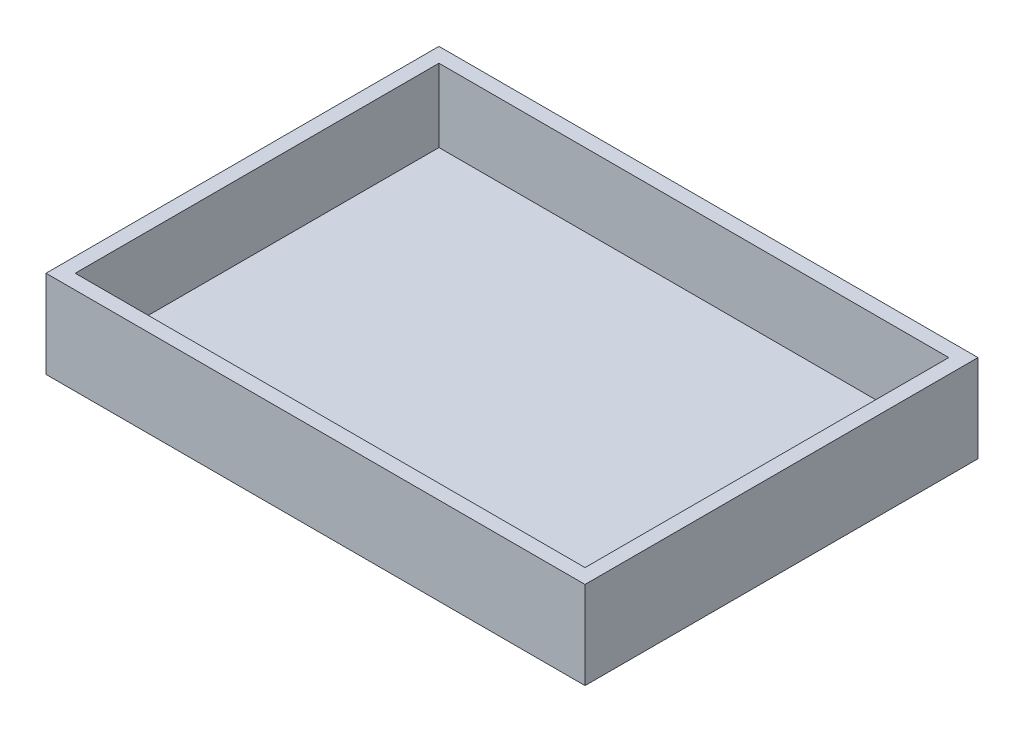
ISO-10303-21;
HEADER;
FILE_DESCRIPTION(('STEP AP214'),'2;1');
FILE_NAME('part.step','',(''),(''),'','','');
FILE_SCHEMA(('AUTOMOTIVE_DESIGN { 1 0 10303 214 1 1 1 1 }'));
ENDSEC;
DATA;
#1=APPLICATION_CONTEXT('core data for automotive mechanical design processes');
#2=APPLICATION_PROTOCOL_DEFINITION('international standard','automotive_design',2000,#1);
#3=PRODUCT_CONTEXT('',#1,'mechanical');
#4=PRODUCT('Part','Part','',(#3));
#5=PRODUCT_RELATED_PRODUCT_CATEGORY('part','',(#4));
#6=PRODUCT_DEFINITION_FORMATION('','',#4);
#7=PRODUCT_DEFINITION_CONTEXT('part definition',#1,'design');
#8=PRODUCT_DEFINITION('design','',#6,#7);
#9=PRODUCT_DEFINITION_SHAPE('','',#8);
#10=(LENGTH_UNIT() NAMED_UNIT(*) SI_UNIT(.MILLI.,.METRE.));
#11=(NAMED_UNIT(*) PLANE_ANGLE_UNIT() SI_UNIT($,.RADIAN.));
#12=(NAMED_UNIT(*) SI_UNIT($,.STERADIAN.) SOLID_ANGLE_UNIT());
#13=UNCERTAINTY_MEASURE_WITH_UNIT(LENGTH_MEASURE(1.E-05),#10,'distance_accuracy_value','');
#14=(GEOMETRIC_REPRESENTATION_CONTEXT(3) GLOBAL_UNCERTAINTY_ASSIGNED_CONTEXT((#13)) GLOBAL_UNIT_ASSIGNED_CONTEXT((#10,
#11,#12)) REPRESENTATION_CONTEXT('',''));
#15=CARTESIAN_POINT('',(0.,0.,0.));
#16=DIRECTION('',(0.,0.,1.));
#17=DIRECTION('',(1.,0.,0.));
#18=AXIS2_PLACEMENT_3D('',#15,#16,#17);
#19=CARTESIAN_POINT('',(0.,10.,0.));
#20=DIRECTION('',(0.,1.,0.));
#21=DIRECTION('',(0.,0.,1.));
#22=AXIS2_PLACEMENT_3D('',#19,#20,#21);
#23=PLANE('',#22);
#24=DIRECTION('',(1.,0.,0.));
#25=VECTOR('',#24,1.);
#26=CARTESIAN_POINT('',(-36.9,10.,26.9));
#27=LINE('',#26,#25);
#28=CARTESIAN_POINT('',(-36.9,10.,26.9));
#29=VERTEX_POINT('',#28);
#30=CARTESIAN_POINT('',(36.9,10.,26.9));
#31=VERTEX_POINT('',#30);
#32=EDGE_CURVE('E184',#29,#31,#27,.T.);
#33=ORIENTED_EDGE('',*,*,#32,.T.);
#34=DIRECTION('',(0.,0.,-1.));
#35=VECTOR('',#34,1.);
#36=CARTESIAN_POINT('',(36.9,10.,26.9));
#37=LINE('',#36,#35);
#38=CARTESIAN_POINT('',(36.9,10.,-26.9));
#39=VERTEX_POINT('',#38);
#40=EDGE_CURVE('E187',#31,#39,#37,.T.);
#41=ORIENTED_EDGE('',*,*,#40,.T.);
#42=DIRECTION('',(-1.,0.,0.));
#43=VECTOR('',#42,1.);
#44=CARTESIAN_POINT('',(-36.9,10.,-26.9));
#45=LINE('',#44,#43);
#46=CARTESIAN_POINT('',(-36.9,10.,-26.9));
#47=VERTEX_POINT('',#46);
#48=EDGE_CURVE('E190',#39,#47,#45,.T.);
#49=ORIENTED_EDGE('',*,*,#48,.T.);
#50=DIRECTION('',(0.,0.,1.));
#51=VECTOR('',#50,1.);
#52=CARTESIAN_POINT('',(-36.9,10.,26.9));
#53=LINE('',#52,#51);
#54=EDGE_CURVE('E71',#47,#29,#53,.T.);
#55=ORIENTED_EDGE('',*,*,#54,.T.);
#56=EDGE_LOOP('',(#33,#41,#49,#55));
#57=FACE_BOUND('',#56,.T.);
#58=DIRECTION('',(-1.,0.,0.));
#59=VECTOR('',#58,1.);
#60=CARTESIAN_POINT('',(-34.9,10.,-24.9));
#61=LINE('',#60,#59);
#62=CARTESIAN_POINT('',(34.9,10.,-24.9));
#63=VERTEX_POINT('',#62);
#64=CARTESIAN_POINT('',(-34.9,10.,-24.9));
#65=VERTEX_POINT('',#64);
#66=EDGE_CURVE('E148',#63,#65,#61,.T.);
#67=ORIENTED_EDGE('',*,*,#66,.F.);
#68=DIRECTION('',(0.,0.,-1.));
#69=VECTOR('',#68,1.);
#70=CARTESIAN_POINT('',(34.9,10.,24.9));
#71=LINE('',#70,#69);
#72=CARTESIAN_POINT('',(34.9,10.,24.9));
#73=VERTEX_POINT('',#72);
#74=EDGE_CURVE('E145',#73,#63,#71,.T.);
#75=ORIENTED_EDGE('',*,*,#74,.F.);
#76=DIRECTION('',(1.,0.,0.));
#77=VECTOR('',#76,1.);
#78=CARTESIAN_POINT('',(-34.9,10.,24.9));
#79=LINE('',#78,#77);
#80=CARTESIAN_POINT('',(-34.9,10.,24.9));
#81=VERTEX_POINT('',#80);
#82=EDGE_CURVE('E155',#81,#73,#79,.T.);
#83=ORIENTED_EDGE('',*,*,#82,.F.);
#84=DIRECTION('',(0.,0.,1.));
#85=VECTOR('',#84,1.);
#86=CARTESIAN_POINT('',(-34.9,10.,24.9));
#87=LINE('',#86,#85);
#88=EDGE_CURVE('E152',#65,#81,#87,.T.);
#89=ORIENTED_EDGE('',*,*,#88,.F.);
#90=EDGE_LOOP('',(#67,#75,#83,#89));
#91=FACE_BOUND('',#90,.T.);
#92=ADVANCED_FACE('F47',(#57,#91),#23,.T.);
#93=CARTESIAN_POINT('',(-36.9,10.,26.9));
#94=DIRECTION('',(0.,0.,-1.));
#95=DIRECTION('',(-1.,0.,0.));
#96=AXIS2_PLACEMENT_3D('',#93,#94,#95);
#97=PLANE('',#96);
#98=DIRECTION('',(0.,-1.,0.));
#99=VECTOR('',#98,1.);
#100=CARTESIAN_POINT('',(-36.9,10.,26.9));
#101=LINE('',#100,#99);
#102=CARTESIAN_POINT('',(-36.9,-2.,26.9));
#103=VERTEX_POINT('',#102);
#104=EDGE_CURVE('E121',#29,#103,#101,.T.);
#105=ORIENTED_EDGE('',*,*,#104,.T.);
#106=DIRECTION('',(-1.,0.,0.));
#107=VECTOR('',#106,1.);
#108=CARTESIAN_POINT('',(-36.9,-2.,26.9));
#109=LINE('',#108,#107);
#110=CARTESIAN_POINT('',(36.9,-2.,26.9));
#111=VERTEX_POINT('',#110);
#112=EDGE_CURVE('E136',#111,#103,#109,.T.);
#113=ORIENTED_EDGE('',*,*,#112,.F.);
#114=DIRECTION('',(0.,-1.,0.));
#115=VECTOR('',#114,1.);
#116=CARTESIAN_POINT('',(36.9,10.,26.9));
#117=LINE('',#116,#115);
#118=EDGE_CURVE('E11',#31,#111,#117,.T.);
#119=ORIENTED_EDGE('',*,*,#118,.F.);
#120=ORIENTED_EDGE('',*,*,#32,.F.);
#121=EDGE_LOOP('',(#105,#113,#119,#120));
#122=FACE_BOUND('',#121,.T.);
#123=ADVANCED_FACE('F49',(#122),#97,.F.);
#124=CARTESIAN_POINT('',(36.9,10.,26.9));
#125=DIRECTION('',(-1.,0.,0.));
#126=DIRECTION('',(0.,0.,1.));
#127=AXIS2_PLACEMENT_3D('',#124,#125,#126);
#128=PLANE('',#127);
#129=ORIENTED_EDGE('',*,*,#118,.T.);
#130=DIRECTION('',(0.,0.,1.));
#131=VECTOR('',#130,1.);
#132=CARTESIAN_POINT('',(36.9,-2.,26.9));
#133=LINE('',#132,#131);
#134=CARTESIAN_POINT('',(36.9,-2.,-26.9));
#135=VERTEX_POINT('',#134);
#136=EDGE_CURVE('E131',#135,#111,#133,.T.);
#137=ORIENTED_EDGE('',*,*,#136,.F.);
#138=DIRECTION('',(0.,-1.,0.));
#139=VECTOR('',#138,1.);
#140=CARTESIAN_POINT('',(36.9,10.,-26.9));
#141=LINE('',#140,#139);
#142=EDGE_CURVE('E56',#39,#135,#141,.T.);
#143=ORIENTED_EDGE('',*,*,#142,.F.);
#144=ORIENTED_EDGE('',*,*,#40,.F.);
#145=EDGE_LOOP('',(#129,#137,#143,#144));
#146=FACE_BOUND('',#145,.T.);
#147=ADVANCED_FACE('F202',(#146),#128,.F.);
#148=CARTESIAN_POINT('',(-36.9,10.,-26.9));
#149=DIRECTION('',(0.,0.,1.));
#150=DIRECTION('',(1.,0.,0.));
#151=AXIS2_PLACEMENT_3D('',#148,#149,#150);
#152=PLANE('',#151);
#153=ORIENTED_EDGE('',*,*,#142,.T.);
#154=DIRECTION('',(1.,0.,0.));
#155=VECTOR('',#154,1.);
#156=CARTESIAN_POINT('',(-36.9,-2.,-26.9));
#157=LINE('',#156,#155);
#158=CARTESIAN_POINT('',(-36.9,-2.,-26.9));
#159=VERTEX_POINT('',#158);
#160=EDGE_CURVE('E124',#159,#135,#157,.T.);
#161=ORIENTED_EDGE('',*,*,#160,.F.);
#162=DIRECTION('',(0.,-1.,0.));
#163=VECTOR('',#162,1.);
#164=CARTESIAN_POINT('',(-36.9,10.,-26.9));
#165=LINE('',#164,#163);
#166=EDGE_CURVE('E113',#47,#159,#165,.T.);
#167=ORIENTED_EDGE('',*,*,#166,.F.);
#168=ORIENTED_EDGE('',*,*,#48,.F.);
#169=EDGE_LOOP('',(#153,#161,#167,#168));
#170=FACE_BOUND('',#169,.T.);
#171=ADVANCED_FACE('F125',(#170),#152,.F.);
#172=CARTESIAN_POINT('',(-36.9,10.,26.9));
#173=DIRECTION('',(1.,0.,0.));
#174=DIRECTION('',(0.,0.,-1.));
#175=AXIS2_PLACEMENT_3D('',#172,#173,#174);
#176=PLANE('',#175);
#177=ORIENTED_EDGE('',*,*,#166,.T.);
#178=DIRECTION('',(0.,0.,-1.));
#179=VECTOR('',#178,1.);
#180=CARTESIAN_POINT('',(-36.9,-2.,26.9));
#181=LINE('',#180,#179);
#182=EDGE_CURVE('E117',#103,#159,#181,.T.);
#183=ORIENTED_EDGE('',*,*,#182,.F.);
#184=ORIENTED_EDGE('',*,*,#104,.F.);
#185=ORIENTED_EDGE('',*,*,#54,.F.);
#186=EDGE_LOOP('',(#177,#183,#184,#185));
#187=FACE_BOUND('',#186,.T.);
#188=ADVANCED_FACE('F115',(#187),#176,.F.);
#189=CARTESIAN_POINT('',(34.9,10.,24.9));
#190=DIRECTION('',(-1.,0.,0.));
#191=DIRECTION('',(0.,0.,1.));
#192=AXIS2_PLACEMENT_3D('',#189,#190,#191);
#193=PLANE('',#192);
#194=DIRECTION('',(0.,0.,-1.));
#195=VECTOR('',#194,1.);
#196=CARTESIAN_POINT('',(34.9,0.,24.9));
#197=LINE('',#196,#195);
#198=CARTESIAN_POINT('',(34.9,0.,24.9));
#199=VERTEX_POINT('',#198);
#200=CARTESIAN_POINT('',(34.9,0.,-24.9));
#201=VERTEX_POINT('',#200);
#202=EDGE_CURVE('E144',#199,#201,#197,.T.);
#203=ORIENTED_EDGE('',*,*,#202,.F.);
#204=DIRECTION('',(0.,-1.,0.));
#205=VECTOR('',#204,1.);
#206=CARTESIAN_POINT('',(34.9,10.,24.9));
#207=LINE('',#206,#205);
#208=EDGE_CURVE('E158',#73,#199,#207,.T.);
#209=ORIENTED_EDGE('',*,*,#208,.F.);
#210=ORIENTED_EDGE('',*,*,#74,.T.);
#211=DIRECTION('',(0.,-1.,0.));
#212=VECTOR('',#211,1.);
#213=CARTESIAN_POINT('',(34.9,10.,-24.9));
#214=LINE('',#213,#212);
#215=EDGE_CURVE('E180',#63,#201,#214,.T.);
#216=ORIENTED_EDGE('',*,*,#215,.T.);
#217=EDGE_LOOP('',(#203,#209,#210,#216));
#218=FACE_BOUND('',#217,.T.);
#219=ADVANCED_FACE('F215',(#218),#193,.T.);
#220=CARTESIAN_POINT('',(-34.9,10.,-24.9));
#221=DIRECTION('',(0.,0.,1.));
#222=DIRECTION('',(1.,0.,0.));
#223=AXIS2_PLACEMENT_3D('',#220,#221,#222);
#224=PLANE('',#223);
#225=DIRECTION('',(-1.,0.,0.));
#226=VECTOR('',#225,1.);
#227=CARTESIAN_POINT('',(-34.9,0.,-24.9));
#228=LINE('',#227,#226);
#229=CARTESIAN_POINT('',(-34.9,0.,-24.9));
#230=VERTEX_POINT('',#229);
#231=EDGE_CURVE('E162',#201,#230,#228,.T.);
#232=ORIENTED_EDGE('',*,*,#231,.F.);
#233=ORIENTED_EDGE('',*,*,#215,.F.);
#234=ORIENTED_EDGE('',*,*,#66,.T.);
#235=DIRECTION('',(0.,-1.,0.));
#236=VECTOR('',#235,1.);
#237=CARTESIAN_POINT('',(-34.9,10.,-24.9));
#238=LINE('',#237,#236);
#239=EDGE_CURVE('E177',#65,#230,#238,.T.);
#240=ORIENTED_EDGE('',*,*,#239,.T.);
#241=EDGE_LOOP('',(#232,#233,#234,#240));
#242=FACE_BOUND('',#241,.T.);
#243=ADVANCED_FACE('F221',(#242),#224,.T.);
#244=CARTESIAN_POINT('',(-34.9,10.,24.9));
#245=DIRECTION('',(1.,0.,0.));
#246=DIRECTION('',(0.,0.,-1.));
#247=AXIS2_PLACEMENT_3D('',#244,#245,#246);
#248=PLANE('',#247);
#249=DIRECTION('',(0.,0.,1.));
#250=VECTOR('',#249,1.);
#251=CARTESIAN_POINT('',(-34.9,0.,24.9));
#252=LINE('',#251,#250);
#253=CARTESIAN_POINT('',(-34.9,0.,24.9));
#254=VERTEX_POINT('',#253);
#255=EDGE_CURVE('E166',#230,#254,#252,.T.);
#256=ORIENTED_EDGE('',*,*,#255,.F.);
#257=ORIENTED_EDGE('',*,*,#239,.F.);
#258=ORIENTED_EDGE('',*,*,#88,.T.);
#259=DIRECTION('',(0.,-1.,0.));
#260=VECTOR('',#259,1.);
#261=CARTESIAN_POINT('',(-34.9,10.,24.9));
#262=LINE('',#261,#260);
#263=EDGE_CURVE('E63',#81,#254,#262,.T.);
#264=ORIENTED_EDGE('',*,*,#263,.T.);
#265=EDGE_LOOP('',(#256,#257,#258,#264));
#266=FACE_BOUND('',#265,.T.);
#267=ADVANCED_FACE('F226',(#266),#248,.T.);
#268=CARTESIAN_POINT('',(-34.9,10.,24.9));
#269=DIRECTION('',(0.,0.,-1.));
#270=DIRECTION('',(-1.,0.,0.));
#271=AXIS2_PLACEMENT_3D('',#268,#269,#270);
#272=PLANE('',#271);
#273=DIRECTION('',(1.,0.,0.));
#274=VECTOR('',#273,1.);
#275=CARTESIAN_POINT('',(-34.9,0.,24.9));
#276=LINE('',#275,#274);
#277=EDGE_CURVE('E149',#254,#199,#276,.T.);
#278=ORIENTED_EDGE('',*,*,#277,.F.);
#279=ORIENTED_EDGE('',*,*,#263,.F.);
#280=ORIENTED_EDGE('',*,*,#82,.T.);
#281=ORIENTED_EDGE('',*,*,#208,.T.);
#282=EDGE_LOOP('',(#278,#279,#280,#281));
#283=FACE_BOUND('',#282,.T.);
#284=ADVANCED_FACE('F235',(#283),#272,.T.);
#285=CARTESIAN_POINT('',(0.,0.,0.));
#286=DIRECTION('',(0.,-1.,0.));
#287=DIRECTION('',(0.,0.,-1.));
#288=AXIS2_PLACEMENT_3D('',#285,#286,#287);
#289=PLANE('',#288);
#290=ORIENTED_EDGE('',*,*,#277,.T.);
#291=ORIENTED_EDGE('',*,*,#202,.T.);
#292=ORIENTED_EDGE('',*,*,#231,.T.);
#293=ORIENTED_EDGE('',*,*,#255,.T.);
#294=EDGE_LOOP('',(#290,#291,#292,#293));
#295=FACE_BOUND('',#294,.T.);
#296=ADVANCED_FACE('F233',(#295),#289,.F.);
#297=CARTESIAN_POINT('',(0.,-2.,0.));
#298=DIRECTION('',(0.,-1.,0.));
#299=DIRECTION('',(0.,0.,-1.));
#300=AXIS2_PLACEMENT_3D('',#297,#298,#299);
#301=PLANE('',#300);
#302=ORIENTED_EDGE('',*,*,#182,.T.);
#303=ORIENTED_EDGE('',*,*,#160,.T.);
#304=ORIENTED_EDGE('',*,*,#136,.T.);
#305=ORIENTED_EDGE('',*,*,#112,.T.);
#306=EDGE_LOOP('',(#302,#303,#304,#305));
#307=FACE_BOUND('',#306,.T.);
#308=ADVANCED_FACE('F134',(#307),#301,.T.);
#309=CLOSED_SHELL('',(#92,#123,#147,#171,#188,#219,#243,#267,#284,#296,#308));
#310=MANIFOLD_SOLID_BREP('B2',#309);
#311=ADVANCED_BREP_SHAPE_REPRESENTATION('',(#18,#310),#14);
#312=SHAPE_DEFINITION_REPRESENTATION(#9,#311);
ENDSEC;
END-ISO-10303-21;
